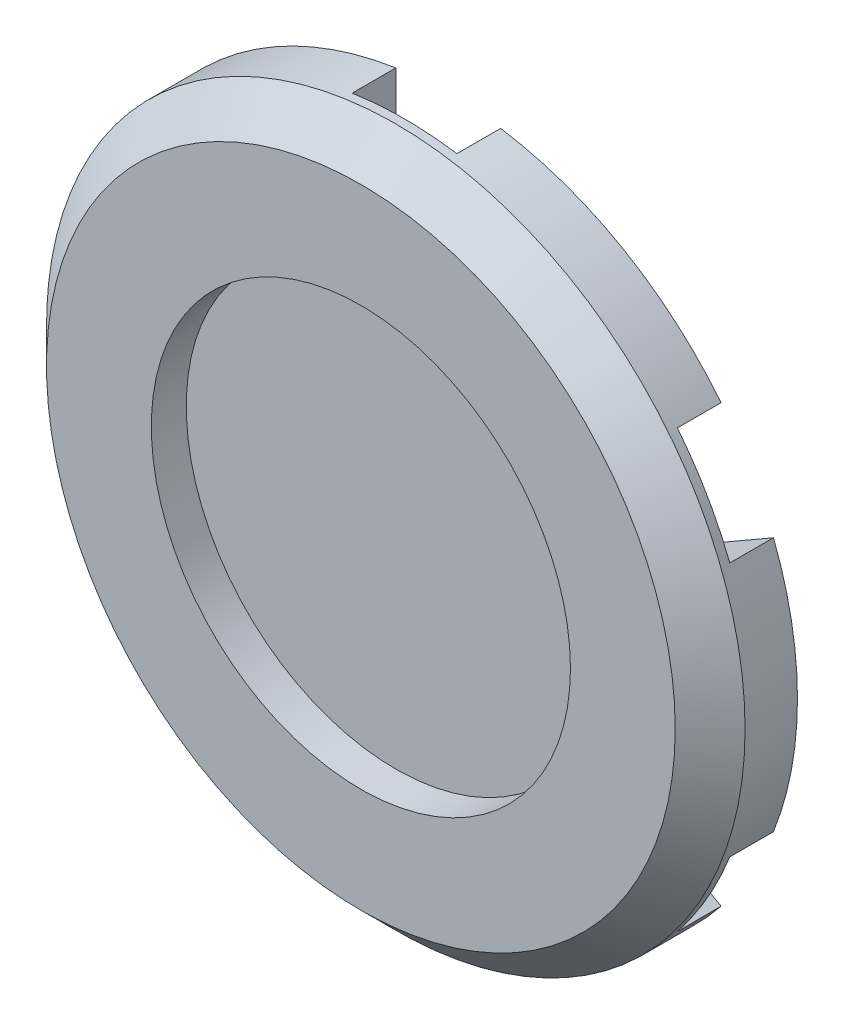
ISO-10303-21;
HEADER;
FILE_DESCRIPTION(('STEP AP214'),'2;1');
FILE_NAME('part.step','',(''),(''),'','','');
FILE_SCHEMA(('AUTOMOTIVE_DESIGN { 1 0 10303 214 1 1 1 1 }'));
ENDSEC;
DATA;
#1=APPLICATION_CONTEXT('core data for automotive mechanical design processes');
#2=APPLICATION_PROTOCOL_DEFINITION('international standard','automotive_design',2000,#1);
#3=PRODUCT_CONTEXT('',#1,'mechanical');
#4=PRODUCT('Part','Part','',(#3));
#5=PRODUCT_RELATED_PRODUCT_CATEGORY('part','',(#4));
#6=PRODUCT_DEFINITION_FORMATION('','',#4);
#7=PRODUCT_DEFINITION_CONTEXT('part definition',#1,'design');
#8=PRODUCT_DEFINITION('design','',#6,#7);
#9=PRODUCT_DEFINITION_SHAPE('','',#8);
#10=(LENGTH_UNIT() NAMED_UNIT(*) SI_UNIT(.MILLI.,.METRE.));
#11=(NAMED_UNIT(*) PLANE_ANGLE_UNIT() SI_UNIT($,.RADIAN.));
#12=(NAMED_UNIT(*) SI_UNIT($,.STERADIAN.) SOLID_ANGLE_UNIT());
#13=UNCERTAINTY_MEASURE_WITH_UNIT(LENGTH_MEASURE(1.E-05),#10,'distance_accuracy_value','');
#14=(GEOMETRIC_REPRESENTATION_CONTEXT(3) GLOBAL_UNCERTAINTY_ASSIGNED_CONTEXT((#13)) GLOBAL_UNIT_ASSIGNED_CONTEXT((#10,
#11,#12)) REPRESENTATION_CONTEXT('',''));
#15=CARTESIAN_POINT('',(0.,0.,0.));
#16=DIRECTION('',(0.,0.,1.));
#17=DIRECTION('',(1.,0.,0.));
#18=AXIS2_PLACEMENT_3D('',#15,#16,#17);
#19=CARTESIAN_POINT('',(0.,0.,25.));
#20=DIRECTION('',(0.,0.,-1.));
#21=DIRECTION('',(-1.,0.,0.));
#22=AXIS2_PLACEMENT_3D('',#19,#20,#21);
#23=CYLINDRICAL_SURFACE('',#22,100.);
#24=CARTESIAN_POINT('',(0.,0.,14.9999999999999));
#25=DIRECTION('',(0.,0.,1.));
#26=DIRECTION('',(1.,0.,0.));
#27=AXIS2_PLACEMENT_3D('',#24,#25,#26);
#28=CIRCLE('',#27,100.);
#29=CARTESIAN_POINT('',(100.,0.,14.9999999999999));
#30=VERTEX_POINT('',#29);
#31=EDGE_CURVE('E11',#30,#30,#28,.F.);
#32=ORIENTED_EDGE('',*,*,#31,.T.);
#33=EDGE_LOOP('',(#32));
#34=FACE_BOUND('',#33,.T.);
#35=CARTESIAN_POINT('',(0.,0.,12.5));
#36=DIRECTION('',(0.,0.,-1.));
#37=DIRECTION('',(-0.50000000000001,0.866025403784433,0.));
#38=AXIS2_PLACEMENT_3D('',#35,#36,#37);
#39=CIRCLE('',#38,100.);
#40=CARTESIAN_POINT('',(-78.1227189477178,-62.4246808899805,12.5));
#41=VERTEX_POINT('',#40);
#42=CARTESIAN_POINT('',(-93.1227189477181,-36.4439187764475,12.5));
#43=VERTEX_POINT('',#42);
#44=EDGE_CURVE('E329',#41,#43,#39,.T.);
#45=ORIENTED_EDGE('',*,*,#44,.F.);
#46=DIRECTION('',(0.,0.,-1.));
#47=VECTOR('',#46,1.);
#48=CARTESIAN_POINT('',(-78.1227189477178,-62.4246808899805,12.5));
#49=LINE('',#48,#47);
#50=CARTESIAN_POINT('',(-78.1227189477178,-62.4246808899805,0.));
#51=VERTEX_POINT('',#50);
#52=EDGE_CURVE('E312',#41,#51,#49,.T.);
#53=ORIENTED_EDGE('',*,*,#52,.T.);
#54=CARTESIAN_POINT('',(0.,0.,0.));
#55=DIRECTION('',(0.,0.,1.));
#56=DIRECTION('',(1.,0.,0.));
#57=AXIS2_PLACEMENT_3D('',#54,#55,#56);
#58=CIRCLE('',#57,100.);
#59=CARTESIAN_POINT('',(-15.,-98.868599666426,0.));
#60=VERTEX_POINT('',#59);
#61=EDGE_CURVE('E452',#51,#60,#58,.T.);
#62=ORIENTED_EDGE('',*,*,#61,.T.);
#63=DIRECTION('',(0.,0.,-1.));
#64=VECTOR('',#63,1.);
#65=CARTESIAN_POINT('',(-15.,-98.868599666426,12.5));
#66=LINE('',#65,#64);
#67=CARTESIAN_POINT('',(-15.,-98.868599666426,12.5));
#68=VERTEX_POINT('',#67);
#69=EDGE_CURVE('E424',#68,#60,#66,.T.);
#70=ORIENTED_EDGE('',*,*,#69,.F.);
#71=CARTESIAN_POINT('',(0.,0.,12.5));
#72=DIRECTION('',(0.,0.,-1.));
#73=DIRECTION('',(-1.,0.,0.));
#74=AXIS2_PLACEMENT_3D('',#71,#72,#73);
#75=CIRCLE('',#74,100.);
#76=CARTESIAN_POINT('',(15.,-98.868599666426,12.5));
#77=VERTEX_POINT('',#76);
#78=EDGE_CURVE('E407',#77,#68,#75,.T.);
#79=ORIENTED_EDGE('',*,*,#78,.F.);
#80=DIRECTION('',(0.,0.,-1.));
#81=VECTOR('',#80,1.);
#82=CARTESIAN_POINT('',(15.,-98.868599666426,12.5));
#83=LINE('',#82,#81);
#84=CARTESIAN_POINT('',(15.,-98.868599666426,0.));
#85=VERTEX_POINT('',#84);
#86=EDGE_CURVE('E434',#77,#85,#83,.T.);
#87=ORIENTED_EDGE('',*,*,#86,.T.);
#88=CARTESIAN_POINT('',(78.1227189477187,-62.4246808899794,0.));
#89=VERTEX_POINT('',#88);
#90=EDGE_CURVE('E456',#85,#89,#58,.T.);
#91=ORIENTED_EDGE('',*,*,#90,.T.);
#92=DIRECTION('',(0.,0.,-1.));
#93=VECTOR('',#92,1.);
#94=CARTESIAN_POINT('',(78.1227189477187,-62.4246808899794,12.5));
#95=LINE('',#94,#93);
#96=CARTESIAN_POINT('',(78.1227189477187,-62.4246808899794,12.5));
#97=VERTEX_POINT('',#96);
#98=EDGE_CURVE('E383',#97,#89,#95,.T.);
#99=ORIENTED_EDGE('',*,*,#98,.F.);
#100=CARTESIAN_POINT('',(0.,0.,12.5));
#101=DIRECTION('',(0.,0.,-1.));
#102=DIRECTION('',(-0.499999999999998,-0.86602540378444,0.));
#103=AXIS2_PLACEMENT_3D('',#100,#101,#102);
#104=CIRCLE('',#103,100.);
#105=CARTESIAN_POINT('',(93.1227189477186,-36.4439187764462,12.5));
#106=VERTEX_POINT('',#105);
#107=EDGE_CURVE('E366',#106,#97,#104,.T.);
#108=ORIENTED_EDGE('',*,*,#107,.F.);
#109=DIRECTION('',(0.,0.,-1.));
#110=VECTOR('',#109,1.);
#111=CARTESIAN_POINT('',(93.1227189477186,-36.4439187764462,12.5));
#112=LINE('',#111,#110);
#113=CARTESIAN_POINT('',(93.1227189477186,-36.4439187764462,0.));
#114=VERTEX_POINT('',#113);
#115=EDGE_CURVE('E395',#106,#114,#112,.T.);
#116=ORIENTED_EDGE('',*,*,#115,.T.);
#117=CARTESIAN_POINT('',(93.1227189477184,36.4439187764468,0.));
#118=VERTEX_POINT('',#117);
#119=EDGE_CURVE('E239',#114,#118,#58,.T.);
#120=ORIENTED_EDGE('',*,*,#119,.T.);
#121=DIRECTION('',(0.,0.,-1.));
#122=VECTOR('',#121,1.);
#123=CARTESIAN_POINT('',(93.1227189477184,36.4439187764468,12.5));
#124=LINE('',#123,#122);
#125=CARTESIAN_POINT('',(93.1227189477184,36.4439187764468,12.5));
#126=VERTEX_POINT('',#125);
#127=EDGE_CURVE('E215',#126,#118,#124,.T.);
#128=ORIENTED_EDGE('',*,*,#127,.F.);
#129=CARTESIAN_POINT('',(0.,0.,12.5));
#130=DIRECTION('',(0.,0.,-1.));
#131=DIRECTION('',(0.500000000000004,-0.866025403784436,0.));
#132=AXIS2_PLACEMENT_3D('',#129,#130,#131);
#133=CIRCLE('',#132,100.);
#134=CARTESIAN_POINT('',(78.1227189477183,62.4246808899799,12.5));
#135=VERTEX_POINT('',#134);
#136=EDGE_CURVE('E223',#135,#126,#133,.T.);
#137=ORIENTED_EDGE('',*,*,#136,.F.);
#138=DIRECTION('',(0.,0.,-1.));
#139=VECTOR('',#138,1.);
#140=CARTESIAN_POINT('',(78.1227189477183,62.4246808899799,12.5));
#141=LINE('',#140,#139);
#142=CARTESIAN_POINT('',(78.1227189477183,62.4246808899799,0.));
#143=VERTEX_POINT('',#142);
#144=EDGE_CURVE('E389',#135,#143,#141,.T.);
#145=ORIENTED_EDGE('',*,*,#144,.T.);
#146=CARTESIAN_POINT('',(15.,98.868599666426,0.));
#147=VERTEX_POINT('',#146);
#148=EDGE_CURVE('E764',#143,#147,#58,.T.);
#149=ORIENTED_EDGE('',*,*,#148,.T.);
#150=DIRECTION('',(0.,0.,-1.));
#151=VECTOR('',#150,1.);
#152=CARTESIAN_POINT('',(15.,98.868599666426,12.5));
#153=LINE('',#152,#151);
#154=CARTESIAN_POINT('',(15.,98.868599666426,12.5));
#155=VERTEX_POINT('',#154);
#156=EDGE_CURVE('E266',#155,#147,#153,.T.);
#157=ORIENTED_EDGE('',*,*,#156,.F.);
#158=CARTESIAN_POINT('',(0.,0.,12.5));
#159=DIRECTION('',(0.,0.,-1.));
#160=DIRECTION('',(1.,0.,0.));
#161=AXIS2_PLACEMENT_3D('',#158,#159,#160);
#162=CIRCLE('',#161,100.);
#163=CARTESIAN_POINT('',(-15.,98.868599666426,12.5));
#164=VERTEX_POINT('',#163);
#165=EDGE_CURVE('E249',#164,#155,#162,.T.);
#166=ORIENTED_EDGE('',*,*,#165,.F.);
#167=DIRECTION('',(0.,0.,-1.));
#168=VECTOR('',#167,1.);
#169=CARTESIAN_POINT('',(-15.,98.868599666426,12.5));
#170=LINE('',#169,#168);
#171=CARTESIAN_POINT('',(-15.,98.868599666426,0.));
#172=VERTEX_POINT('',#171);
#173=EDGE_CURVE('E278',#164,#172,#170,.T.);
#174=ORIENTED_EDGE('',*,*,#173,.T.);
#175=CARTESIAN_POINT('',(-78.1227189477191,62.4246808899788,0.));
#176=VERTEX_POINT('',#175);
#177=EDGE_CURVE('E771',#172,#176,#58,.T.);
#178=ORIENTED_EDGE('',*,*,#177,.T.);
#179=DIRECTION('',(0.,0.,-1.));
#180=VECTOR('',#179,1.);
#181=CARTESIAN_POINT('',(-78.1227189477191,62.4246808899788,12.5));
#182=LINE('',#181,#180);
#183=CARTESIAN_POINT('',(-78.1227189477191,62.4246808899788,12.5));
#184=VERTEX_POINT('',#183);
#185=EDGE_CURVE('E71',#184,#176,#182,.T.);
#186=ORIENTED_EDGE('',*,*,#185,.F.);
#187=CARTESIAN_POINT('',(0.,0.,12.5));
#188=DIRECTION('',(0.,0.,-1.));
#189=DIRECTION('',(0.499999999999992,0.866025403784443,0.));
#190=AXIS2_PLACEMENT_3D('',#187,#188,#189);
#191=CIRCLE('',#190,100.);
#192=CARTESIAN_POINT('',(-93.1227189477189,36.4439187764455,12.5));
#193=VERTEX_POINT('',#192);
#194=EDGE_CURVE('E291',#193,#184,#191,.T.);
#195=ORIENTED_EDGE('',*,*,#194,.F.);
#196=DIRECTION('',(0.,0.,-1.));
#197=VECTOR('',#196,1.);
#198=CARTESIAN_POINT('',(-93.1227189477189,36.4439187764455,12.5));
#199=LINE('',#198,#197);
#200=CARTESIAN_POINT('',(-93.1227189477189,36.4439187764455,0.));
#201=VERTEX_POINT('',#200);
#202=EDGE_CURVE('E272',#193,#201,#199,.T.);
#203=ORIENTED_EDGE('',*,*,#202,.T.);
#204=CARTESIAN_POINT('',(-93.1227189477181,-36.4439187764475,0.));
#205=VERTEX_POINT('',#204);
#206=EDGE_CURVE('E775',#201,#205,#58,.T.);
#207=ORIENTED_EDGE('',*,*,#206,.T.);
#208=DIRECTION('',(0.,0.,-1.));
#209=VECTOR('',#208,1.);
#210=CARTESIAN_POINT('',(-93.1227189477181,-36.4439187764475,12.5));
#211=LINE('',#210,#209);
#212=EDGE_CURVE('E63',#43,#205,#211,.T.);
#213=ORIENTED_EDGE('',*,*,#212,.F.);
#214=EDGE_LOOP('',(#45,#53,#62,#70,#79,#87,#91,#99,#108,#116,#120,#128,#137,#145,#149,#157,#166,
#174,#178,#186,#195,#203,#207,#213));
#215=FACE_BOUND('',#214,.T.);
#216=ADVANCED_FACE('F46',(#34,#215),#23,.T.);
#217=CARTESIAN_POINT('',(0.,0.,25.));
#218=DIRECTION('',(0.,0.,1.));
#219=DIRECTION('',(1.,0.,0.));
#220=AXIS2_PLACEMENT_3D('',#217,#218,#219);
#221=PLANE('',#220);
#222=CARTESIAN_POINT('',(0.,0.,25.));
#223=DIRECTION('',(0.,0.,1.));
#224=DIRECTION('',(1.,0.,0.));
#225=AXIS2_PLACEMENT_3D('',#222,#223,#224);
#226=CIRCLE('',#225,89.9999999999999);
#227=CARTESIAN_POINT('',(89.9999999999999,0.,25.));
#228=VERTEX_POINT('',#227);
#229=EDGE_CURVE('E56',#228,#228,#226,.T.);
#230=ORIENTED_EDGE('',*,*,#229,.T.);
#231=EDGE_LOOP('',(#230));
#232=FACE_BOUND('',#231,.T.);
#233=CARTESIAN_POINT('',(0.,0.,25.));
#234=DIRECTION('',(0.,0.,1.));
#235=DIRECTION('',(1.,0.,0.));
#236=AXIS2_PLACEMENT_3D('',#233,#234,#235);
#237=CIRCLE('',#236,60.);
#238=CARTESIAN_POINT('',(60.,0.,25.));
#239=VERTEX_POINT('',#238);
#240=EDGE_CURVE('E438',#239,#239,#237,.T.);
#241=ORIENTED_EDGE('',*,*,#240,.F.);
#242=EDGE_LOOP('',(#241));
#243=FACE_BOUND('',#242,.T.);
#244=ADVANCED_FACE('F463',(#232,#243),#221,.T.);
#245=CARTESIAN_POINT('',(0.,0.,0.));
#246=DIRECTION('',(0.,0.,1.));
#247=DIRECTION('',(1.,0.,0.));
#248=AXIS2_PLACEMENT_3D('',#245,#246,#247);
#249=PLANE('',#248);
#250=ORIENTED_EDGE('',*,*,#61,.F.);
#251=DIRECTION('',(-0.866025403784433,-0.50000000000001,0.));
#252=VECTOR('',#251,1.);
#253=CARTESIAN_POINT('',(-78.1227189477178,-62.4246808899805,0.));
#254=LINE('',#253,#252);
#255=CARTESIAN_POINT('',(-52.1419568341848,-47.4246808899802,0.));
#256=VERTEX_POINT('',#255);
#257=EDGE_CURVE('E334',#256,#51,#254,.T.);
#258=ORIENTED_EDGE('',*,*,#257,.F.);
#259=DIRECTION('',(0.50000000000001,-0.866025403784433,0.));
#260=VECTOR('',#259,1.);
#261=CARTESIAN_POINT('',(-67.1419568341851,-21.4439187764472,0.));
#262=LINE('',#261,#260);
#263=CARTESIAN_POINT('',(-67.1419568341851,-21.4439187764472,0.));
#264=VERTEX_POINT('',#263);
#265=EDGE_CURVE('E349',#264,#256,#262,.T.);
#266=ORIENTED_EDGE('',*,*,#265,.F.);
#267=DIRECTION('',(0.866025403784433,0.50000000000001,0.));
#268=VECTOR('',#267,1.);
#269=CARTESIAN_POINT('',(-93.1227189477181,-36.4439187764475,0.));
#270=LINE('',#269,#268);
#271=EDGE_CURVE('E346',#205,#264,#270,.T.);
#272=ORIENTED_EDGE('',*,*,#271,.F.);
#273=ORIENTED_EDGE('',*,*,#206,.F.);
#274=DIRECTION('',(-0.866025403784443,0.499999999999992,0.));
#275=VECTOR('',#274,1.);
#276=CARTESIAN_POINT('',(-93.1227189477189,36.4439187764455,0.));
#277=LINE('',#276,#275);
#278=CARTESIAN_POINT('',(-67.1419568341856,21.4439187764458,0.));
#279=VERTEX_POINT('',#278);
#280=EDGE_CURVE('E296',#279,#201,#277,.T.);
#281=ORIENTED_EDGE('',*,*,#280,.F.);
#282=DIRECTION('',(-0.499999999999992,-0.866025403784443,0.));
#283=VECTOR('',#282,1.);
#284=CARTESIAN_POINT('',(-52.1419568341858,47.4246808899791,0.));
#285=LINE('',#284,#283);
#286=CARTESIAN_POINT('',(-52.1419568341858,47.4246808899791,0.));
#287=VERTEX_POINT('',#286);
#288=EDGE_CURVE('E311',#287,#279,#285,.T.);
#289=ORIENTED_EDGE('',*,*,#288,.F.);
#290=DIRECTION('',(0.866025403784443,-0.499999999999992,0.));
#291=VECTOR('',#290,1.);
#292=CARTESIAN_POINT('',(-78.1227189477191,62.4246808899788,0.));
#293=LINE('',#292,#291);
#294=EDGE_CURVE('E308',#176,#287,#293,.T.);
#295=ORIENTED_EDGE('',*,*,#294,.F.);
#296=ORIENTED_EDGE('',*,*,#177,.F.);
#297=DIRECTION('',(0.,1.,0.));
#298=VECTOR('',#297,1.);
#299=CARTESIAN_POINT('',(-15.,98.868599666426,0.));
#300=LINE('',#299,#298);
#301=CARTESIAN_POINT('',(-15.,68.868599666426,0.));
#302=VERTEX_POINT('',#301);
#303=EDGE_CURVE('E254',#302,#172,#300,.T.);
#304=ORIENTED_EDGE('',*,*,#303,.F.);
#305=DIRECTION('',(-1.,0.,0.));
#306=VECTOR('',#305,1.);
#307=CARTESIAN_POINT('',(15.,68.868599666426,0.));
#308=LINE('',#307,#306);
#309=CARTESIAN_POINT('',(15.,68.868599666426,0.));
#310=VERTEX_POINT('',#309);
#311=EDGE_CURVE('E271',#310,#302,#308,.T.);
#312=ORIENTED_EDGE('',*,*,#311,.F.);
#313=DIRECTION('',(0.,-1.,0.));
#314=VECTOR('',#313,1.);
#315=CARTESIAN_POINT('',(15.,98.868599666426,0.));
#316=LINE('',#315,#314);
#317=EDGE_CURVE('E267',#147,#310,#316,.T.);
#318=ORIENTED_EDGE('',*,*,#317,.F.);
#319=ORIENTED_EDGE('',*,*,#148,.F.);
#320=DIRECTION('',(0.866025403784436,0.500000000000004,0.));
#321=VECTOR('',#320,1.);
#322=CARTESIAN_POINT('',(78.1227189477183,62.4246808899799,0.));
#323=LINE('',#322,#321);
#324=CARTESIAN_POINT('',(52.1419568341852,47.4246808899798,0.));
#325=VERTEX_POINT('',#324);
#326=EDGE_CURVE('E233',#325,#143,#323,.T.);
#327=ORIENTED_EDGE('',*,*,#326,.F.);
#328=DIRECTION('',(-0.500000000000004,0.866025403784436,0.));
#329=VECTOR('',#328,1.);
#330=CARTESIAN_POINT('',(67.1419568341853,21.4439187764467,0.));
#331=LINE('',#330,#329);
#332=CARTESIAN_POINT('',(67.1419568341853,21.4439187764467,0.));
#333=VERTEX_POINT('',#332);
#334=EDGE_CURVE('E760',#333,#325,#331,.T.);
#335=ORIENTED_EDGE('',*,*,#334,.F.);
#336=DIRECTION('',(-0.866025403784437,-0.500000000000004,0.));
#337=VECTOR('',#336,1.);
#338=CARTESIAN_POINT('',(93.1227189477184,36.4439187764468,0.));
#339=LINE('',#338,#337);
#340=EDGE_CURVE('E282',#118,#333,#339,.T.);
#341=ORIENTED_EDGE('',*,*,#340,.F.);
#342=ORIENTED_EDGE('',*,*,#119,.F.);
#343=DIRECTION('',(0.86602540378444,-0.499999999999998,0.));
#344=VECTOR('',#343,1.);
#345=CARTESIAN_POINT('',(93.1227189477186,-36.4439187764462,0.));
#346=LINE('',#345,#344);
#347=CARTESIAN_POINT('',(67.1419568341854,-21.4439187764462,0.));
#348=VERTEX_POINT('',#347);
#349=EDGE_CURVE('E371',#348,#114,#346,.T.);
#350=ORIENTED_EDGE('',*,*,#349,.F.);
#351=DIRECTION('',(0.499999999999998,0.86602540378444,0.));
#352=VECTOR('',#351,1.);
#353=CARTESIAN_POINT('',(52.1419568341855,-47.4246808899794,0.));
#354=LINE('',#353,#352);
#355=CARTESIAN_POINT('',(52.1419568341855,-47.4246808899794,0.));
#356=VERTEX_POINT('',#355);
#357=EDGE_CURVE('E388',#356,#348,#354,.T.);
#358=ORIENTED_EDGE('',*,*,#357,.F.);
#359=DIRECTION('',(-0.86602540378444,0.499999999999998,0.));
#360=VECTOR('',#359,1.);
#361=CARTESIAN_POINT('',(78.1227189477187,-62.4246808899794,0.));
#362=LINE('',#361,#360);
#363=EDGE_CURVE('E384',#89,#356,#362,.T.);
#364=ORIENTED_EDGE('',*,*,#363,.F.);
#365=ORIENTED_EDGE('',*,*,#90,.F.);
#366=DIRECTION('',(0.,-1.,0.));
#367=VECTOR('',#366,1.);
#368=CARTESIAN_POINT('',(15.,-98.868599666426,0.));
#369=LINE('',#368,#367);
#370=CARTESIAN_POINT('',(15.,-68.868599666426,0.));
#371=VERTEX_POINT('',#370);
#372=EDGE_CURVE('E412',#371,#85,#369,.T.);
#373=ORIENTED_EDGE('',*,*,#372,.F.);
#374=DIRECTION('',(1.,0.,0.));
#375=VECTOR('',#374,1.);
#376=CARTESIAN_POINT('',(-15.,-68.868599666426,0.));
#377=LINE('',#376,#375);
#378=CARTESIAN_POINT('',(-15.,-68.868599666426,0.));
#379=VERTEX_POINT('',#378);
#380=EDGE_CURVE('E428',#379,#371,#377,.T.);
#381=ORIENTED_EDGE('',*,*,#380,.F.);
#382=DIRECTION('',(0.,1.,0.));
#383=VECTOR('',#382,1.);
#384=CARTESIAN_POINT('',(-15.,-98.868599666426,0.));
#385=LINE('',#384,#383);
#386=EDGE_CURVE('E398',#60,#379,#385,.T.);
#387=ORIENTED_EDGE('',*,*,#386,.F.);
#388=EDGE_LOOP('',(#250,#258,#266,#272,#273,#281,#289,#295,#296,#304,#312,#318,#319,#327,#335,
#341,#342,#350,#358,#364,#365,#373,#381,#387));
#389=FACE_BOUND('',#388,.T.);
#390=ADVANCED_FACE('F488',(#389),#249,.F.);
#391=CARTESIAN_POINT('',(0.,0.,15.));
#392=DIRECTION('',(0.,0.,1.));
#393=DIRECTION('',(1.,0.,0.));
#394=AXIS2_PLACEMENT_3D('',#391,#392,#393);
#395=CYLINDRICAL_SURFACE('',#394,60.);
#396=CARTESIAN_POINT('',(0.,0.,15.));
#397=DIRECTION('',(0.,0.,1.));
#398=DIRECTION('',(1.,0.,0.));
#399=AXIS2_PLACEMENT_3D('',#396,#397,#398);
#400=CIRCLE('',#399,60.);
#401=CARTESIAN_POINT('',(60.,0.,15.));
#402=VERTEX_POINT('',#401);
#403=EDGE_CURVE('E448',#402,#402,#400,.T.);
#404=ORIENTED_EDGE('',*,*,#403,.F.);
#405=EDGE_LOOP('',(#404));
#406=FACE_BOUND('',#405,.T.);
#407=ORIENTED_EDGE('',*,*,#240,.T.);
#408=EDGE_LOOP('',(#407));
#409=FACE_BOUND('',#408,.T.);
#410=ADVANCED_FACE('F478',(#406,#409),#395,.F.);
#411=CARTESIAN_POINT('',(0.,0.,15.));
#412=DIRECTION('',(0.,0.,1.));
#413=DIRECTION('',(1.,0.,0.));
#414=AXIS2_PLACEMENT_3D('',#411,#412,#413);
#415=PLANE('',#414);
#416=ORIENTED_EDGE('',*,*,#403,.T.);
#417=EDGE_LOOP('',(#416));
#418=FACE_BOUND('',#417,.T.);
#419=ADVANCED_FACE('F468',(#418),#415,.T.);
#420=CARTESIAN_POINT('',(0.,0.,25.));
#421=DIRECTION('',(0.,0.,-1.));
#422=DIRECTION('',(-1.,0.,0.));
#423=AXIS2_PLACEMENT_3D('',#420,#421,#422);
#424=CONICAL_SURFACE('',#423,89.9999999999999,0.785398163397448);
#425=ORIENTED_EDGE('',*,*,#31,.F.);
#426=EDGE_LOOP('',(#425));
#427=FACE_BOUND('',#426,.T.);
#428=ORIENTED_EDGE('',*,*,#229,.F.);
#429=EDGE_LOOP('',(#428));
#430=FACE_BOUND('',#429,.T.);
#431=ADVANCED_FACE('F49',(#427,#430),#424,.T.);
#432=CARTESIAN_POINT('',(15.,-98.868599666426,12.5));
#433=DIRECTION('',(1.,0.,0.));
#434=DIRECTION('',(0.,1.,0.));
#435=AXIS2_PLACEMENT_3D('',#432,#433,#434);
#436=PLANE('',#435);
#437=ORIENTED_EDGE('',*,*,#372,.T.);
#438=ORIENTED_EDGE('',*,*,#86,.F.);
#439=DIRECTION('',(0.,-1.,0.));
#440=VECTOR('',#439,1.);
#441=CARTESIAN_POINT('',(15.,-98.868599666426,12.5));
#442=LINE('',#441,#440);
#443=CARTESIAN_POINT('',(15.,-68.868599666426,12.5));
#444=VERTEX_POINT('',#443);
#445=EDGE_CURVE('E420',#444,#77,#442,.T.);
#446=ORIENTED_EDGE('',*,*,#445,.F.);
#447=DIRECTION('',(0.,0.,-1.));
#448=VECTOR('',#447,1.);
#449=CARTESIAN_POINT('',(15.,-68.868599666426,12.5));
#450=LINE('',#449,#448);
#451=EDGE_CURVE('E439',#444,#371,#450,.T.);
#452=ORIENTED_EDGE('',*,*,#451,.T.);
#453=EDGE_LOOP('',(#437,#438,#446,#452));
#454=FACE_BOUND('',#453,.T.);
#455=ADVANCED_FACE('F467',(#454),#436,.F.);
#456=CARTESIAN_POINT('',(-15.,-68.868599666426,12.5));
#457=DIRECTION('',(0.,1.,0.));
#458=DIRECTION('',(0.,0.,1.));
#459=AXIS2_PLACEMENT_3D('',#456,#457,#458);
#460=PLANE('',#459);
#461=ORIENTED_EDGE('',*,*,#380,.T.);
#462=ORIENTED_EDGE('',*,*,#451,.F.);
#463=DIRECTION('',(1.,0.,0.));
#464=VECTOR('',#463,1.);
#465=CARTESIAN_POINT('',(-15.,-68.868599666426,12.5));
#466=LINE('',#465,#464);
#467=CARTESIAN_POINT('',(-15.,-68.868599666426,12.5));
#468=VERTEX_POINT('',#467);
#469=EDGE_CURVE('E416',#468,#444,#466,.T.);
#470=ORIENTED_EDGE('',*,*,#469,.F.);
#471=DIRECTION('',(0.,0.,-1.));
#472=VECTOR('',#471,1.);
#473=CARTESIAN_POINT('',(-15.,-68.868599666426,12.5));
#474=LINE('',#473,#472);
#475=EDGE_CURVE('E442',#468,#379,#474,.T.);
#476=ORIENTED_EDGE('',*,*,#475,.T.);
#477=EDGE_LOOP('',(#461,#462,#470,#476));
#478=FACE_BOUND('',#477,.T.);
#479=ADVANCED_FACE('F474',(#478),#460,.F.);
#480=CARTESIAN_POINT('',(-15.,-98.868599666426,12.5));
#481=DIRECTION('',(-1.,0.,0.));
#482=DIRECTION('',(0.,-1.,0.));
#483=AXIS2_PLACEMENT_3D('',#480,#481,#482);
#484=PLANE('',#483);
#485=ORIENTED_EDGE('',*,*,#386,.T.);
#486=ORIENTED_EDGE('',*,*,#475,.F.);
#487=DIRECTION('',(0.,1.,0.));
#488=VECTOR('',#487,1.);
#489=CARTESIAN_POINT('',(-15.,-98.868599666426,12.5));
#490=LINE('',#489,#488);
#491=EDGE_CURVE('E411',#68,#468,#490,.T.);
#492=ORIENTED_EDGE('',*,*,#491,.F.);
#493=ORIENTED_EDGE('',*,*,#69,.T.);
#494=EDGE_LOOP('',(#485,#486,#492,#493));
#495=FACE_BOUND('',#494,.T.);
#496=ADVANCED_FACE('F496',(#495),#484,.F.);
#497=CARTESIAN_POINT('',(0.,0.,12.5));
#498=DIRECTION('',(0.,0.,-1.));
#499=DIRECTION('',(-1.,0.,0.));
#500=AXIS2_PLACEMENT_3D('',#497,#498,#499);
#501=PLANE('',#500);
#502=ORIENTED_EDGE('',*,*,#78,.T.);
#503=ORIENTED_EDGE('',*,*,#491,.T.);
#504=ORIENTED_EDGE('',*,*,#469,.T.);
#505=ORIENTED_EDGE('',*,*,#445,.T.);
#506=EDGE_LOOP('',(#502,#503,#504,#505));
#507=FACE_BOUND('',#506,.T.);
#508=ADVANCED_FACE('F499',(#507),#501,.T.);
#509=CARTESIAN_POINT('',(93.1227189477186,-36.4439187764462,12.5));
#510=DIRECTION('',(0.499999999999998,0.86602540378444,0.));
#511=DIRECTION('',(-0.86602540378444,0.499999999999998,0.));
#512=AXIS2_PLACEMENT_3D('',#509,#510,#511);
#513=PLANE('',#512);
#514=ORIENTED_EDGE('',*,*,#349,.T.);
#515=ORIENTED_EDGE('',*,*,#115,.F.);
#516=DIRECTION('',(0.86602540378444,-0.499999999999998,0.));
#517=VECTOR('',#516,1.);
#518=CARTESIAN_POINT('',(93.1227189477186,-36.4439187764462,12.5));
#519=LINE('',#518,#517);
#520=CARTESIAN_POINT('',(67.1419568341854,-21.4439187764462,12.5));
#521=VERTEX_POINT('',#520);
#522=EDGE_CURVE('E379',#521,#106,#519,.T.);
#523=ORIENTED_EDGE('',*,*,#522,.F.);
#524=DIRECTION('',(0.,0.,-1.));
#525=VECTOR('',#524,1.);
#526=CARTESIAN_POINT('',(67.1419568341854,-21.4439187764462,12.5));
#527=LINE('',#526,#525);
#528=EDGE_CURVE('E399',#521,#348,#527,.T.);
#529=ORIENTED_EDGE('',*,*,#528,.T.);
#530=EDGE_LOOP('',(#514,#515,#523,#529));
#531=FACE_BOUND('',#530,.T.);
#532=ADVANCED_FACE('F505',(#531),#513,.F.);
#533=CARTESIAN_POINT('',(52.1419568341855,-47.4246808899794,12.5));
#534=DIRECTION('',(-0.86602540378444,0.499999999999998,0.));
#535=DIRECTION('',(-0.499999999999998,-0.86602540378444,0.));
#536=AXIS2_PLACEMENT_3D('',#533,#534,#535);
#537=PLANE('',#536);
#538=ORIENTED_EDGE('',*,*,#357,.T.);
#539=ORIENTED_EDGE('',*,*,#528,.F.);
#540=DIRECTION('',(0.499999999999998,0.86602540378444,0.));
#541=VECTOR('',#540,1.);
#542=CARTESIAN_POINT('',(52.1419568341855,-47.4246808899794,12.5));
#543=LINE('',#542,#541);
#544=CARTESIAN_POINT('',(52.1419568341855,-47.4246808899794,12.5));
#545=VERTEX_POINT('',#544);
#546=EDGE_CURVE('E375',#545,#521,#543,.T.);
#547=ORIENTED_EDGE('',*,*,#546,.F.);
#548=DIRECTION('',(0.,0.,-1.));
#549=VECTOR('',#548,1.);
#550=CARTESIAN_POINT('',(52.1419568341855,-47.4246808899794,12.5));
#551=LINE('',#550,#549);
#552=EDGE_CURVE('E402',#545,#356,#551,.T.);
#553=ORIENTED_EDGE('',*,*,#552,.T.);
#554=EDGE_LOOP('',(#538,#539,#547,#553));
#555=FACE_BOUND('',#554,.T.);
#556=ADVANCED_FACE('F511',(#555),#537,.F.);
#557=CARTESIAN_POINT('',(78.1227189477187,-62.4246808899794,12.5));
#558=DIRECTION('',(-0.499999999999998,-0.86602540378444,0.));
#559=DIRECTION('',(0.86602540378444,-0.499999999999998,0.));
#560=AXIS2_PLACEMENT_3D('',#557,#558,#559);
#561=PLANE('',#560);
#562=ORIENTED_EDGE('',*,*,#363,.T.);
#563=ORIENTED_EDGE('',*,*,#552,.F.);
#564=DIRECTION('',(-0.86602540378444,0.499999999999998,0.));
#565=VECTOR('',#564,1.);
#566=CARTESIAN_POINT('',(78.1227189477187,-62.4246808899794,12.5));
#567=LINE('',#566,#565);
#568=EDGE_CURVE('E370',#97,#545,#567,.T.);
#569=ORIENTED_EDGE('',*,*,#568,.F.);
#570=ORIENTED_EDGE('',*,*,#98,.T.);
#571=EDGE_LOOP('',(#562,#563,#569,#570));
#572=FACE_BOUND('',#571,.T.);
#573=ADVANCED_FACE('F507',(#572),#561,.F.);
#574=CARTESIAN_POINT('',(0.,0.,12.5));
#575=DIRECTION('',(0.,0.,-1.));
#576=DIRECTION('',(-0.499999999999998,-0.86602540378444,0.));
#577=AXIS2_PLACEMENT_3D('',#574,#575,#576);
#578=PLANE('',#577);
#579=ORIENTED_EDGE('',*,*,#107,.T.);
#580=ORIENTED_EDGE('',*,*,#568,.T.);
#581=ORIENTED_EDGE('',*,*,#546,.T.);
#582=ORIENTED_EDGE('',*,*,#522,.T.);
#583=EDGE_LOOP('',(#579,#580,#581,#582));
#584=FACE_BOUND('',#583,.T.);
#585=ADVANCED_FACE('F510',(#584),#578,.T.);
#586=CARTESIAN_POINT('',(78.1227189477183,62.4246808899799,12.5));
#587=DIRECTION('',(-0.500000000000004,0.866025403784436,0.));
#588=DIRECTION('',(-0.866025403784436,-0.500000000000004,0.));
#589=AXIS2_PLACEMENT_3D('',#586,#587,#588);
#590=PLANE('',#589);
#591=ORIENTED_EDGE('',*,*,#326,.T.);
#592=ORIENTED_EDGE('',*,*,#144,.F.);
#593=DIRECTION('',(0.866025403784436,0.500000000000004,0.));
#594=VECTOR('',#593,1.);
#595=CARTESIAN_POINT('',(78.1227189477183,62.4246808899799,12.5));
#596=LINE('',#595,#594);
#597=CARTESIAN_POINT('',(52.1419568341852,47.4246808899798,12.5));
#598=VERTEX_POINT('',#597);
#599=EDGE_CURVE('E229',#598,#135,#596,.T.);
#600=ORIENTED_EDGE('',*,*,#599,.F.);
#601=DIRECTION('',(0.,0.,-1.));
#602=VECTOR('',#601,1.);
#603=CARTESIAN_POINT('',(52.1419568341852,47.4246808899798,12.5));
#604=LINE('',#603,#602);
#605=EDGE_CURVE('E244',#598,#325,#604,.T.);
#606=ORIENTED_EDGE('',*,*,#605,.T.);
#607=EDGE_LOOP('',(#591,#592,#600,#606));
#608=FACE_BOUND('',#607,.T.);
#609=ADVANCED_FACE('F521',(#608),#590,.F.);
#610=CARTESIAN_POINT('',(67.1419568341853,21.4439187764467,12.5));
#611=DIRECTION('',(-0.866025403784436,-0.500000000000004,0.));
#612=DIRECTION('',(0.500000000000004,-0.866025403784436,0.));
#613=AXIS2_PLACEMENT_3D('',#610,#611,#612);
#614=PLANE('',#613);
#615=ORIENTED_EDGE('',*,*,#334,.T.);
#616=ORIENTED_EDGE('',*,*,#605,.F.);
#617=DIRECTION('',(-0.500000000000004,0.866025403784436,0.));
#618=VECTOR('',#617,1.);
#619=CARTESIAN_POINT('',(67.1419568341853,21.4439187764467,12.5));
#620=LINE('',#619,#618);
#621=CARTESIAN_POINT('',(67.1419568341853,21.4439187764467,12.5));
#622=VERTEX_POINT('',#621);
#623=EDGE_CURVE('E222',#622,#598,#620,.T.);
#624=ORIENTED_EDGE('',*,*,#623,.F.);
#625=DIRECTION('',(0.,0.,-1.));
#626=VECTOR('',#625,1.);
#627=CARTESIAN_POINT('',(67.1419568341853,21.4439187764467,12.5));
#628=LINE('',#627,#626);
#629=EDGE_CURVE('E217',#622,#333,#628,.T.);
#630=ORIENTED_EDGE('',*,*,#629,.T.);
#631=EDGE_LOOP('',(#615,#616,#624,#630));
#632=FACE_BOUND('',#631,.T.);
#633=ADVANCED_FACE('F571',(#632),#614,.F.);
#634=CARTESIAN_POINT('',(93.1227189477184,36.4439187764468,12.5));
#635=DIRECTION('',(0.500000000000004,-0.866025403784436,0.));
#636=DIRECTION('',(0.866025403784436,0.500000000000004,0.));
#637=AXIS2_PLACEMENT_3D('',#634,#635,#636);
#638=PLANE('',#637);
#639=ORIENTED_EDGE('',*,*,#340,.T.);
#640=ORIENTED_EDGE('',*,*,#629,.F.);
#641=DIRECTION('',(-0.866025403784437,-0.500000000000004,0.));
#642=VECTOR('',#641,1.);
#643=CARTESIAN_POINT('',(93.1227189477184,36.4439187764468,12.5));
#644=LINE('',#643,#642);
#645=EDGE_CURVE('E210',#126,#622,#644,.T.);
#646=ORIENTED_EDGE('',*,*,#645,.F.);
#647=ORIENTED_EDGE('',*,*,#127,.T.);
#648=EDGE_LOOP('',(#639,#640,#646,#647));
#649=FACE_BOUND('',#648,.T.);
#650=ADVANCED_FACE('F213',(#649),#638,.F.);
#651=CARTESIAN_POINT('',(0.,0.,12.5));
#652=DIRECTION('',(0.,0.,-1.));
#653=DIRECTION('',(0.500000000000004,-0.866025403784436,0.));
#654=AXIS2_PLACEMENT_3D('',#651,#652,#653);
#655=PLANE('',#654);
#656=ORIENTED_EDGE('',*,*,#136,.T.);
#657=ORIENTED_EDGE('',*,*,#645,.T.);
#658=ORIENTED_EDGE('',*,*,#623,.T.);
#659=ORIENTED_EDGE('',*,*,#599,.T.);
#660=EDGE_LOOP('',(#656,#657,#658,#659));
#661=FACE_BOUND('',#660,.T.);
#662=ADVANCED_FACE('F227',(#661),#655,.T.);
#663=CARTESIAN_POINT('',(-15.,98.868599666426,12.5));
#664=DIRECTION('',(-1.,0.,0.));
#665=DIRECTION('',(0.,-1.,0.));
#666=AXIS2_PLACEMENT_3D('',#663,#664,#665);
#667=PLANE('',#666);
#668=ORIENTED_EDGE('',*,*,#303,.T.);
#669=ORIENTED_EDGE('',*,*,#173,.F.);
#670=DIRECTION('',(0.,1.,0.));
#671=VECTOR('',#670,1.);
#672=CARTESIAN_POINT('',(-15.,98.868599666426,12.5));
#673=LINE('',#672,#671);
#674=CARTESIAN_POINT('',(-15.,68.868599666426,12.5));
#675=VERTEX_POINT('',#674);
#676=EDGE_CURVE('E262',#675,#164,#673,.T.);
#677=ORIENTED_EDGE('',*,*,#676,.F.);
#678=DIRECTION('',(0.,0.,-1.));
#679=VECTOR('',#678,1.);
#680=CARTESIAN_POINT('',(-15.,68.868599666426,12.5));
#681=LINE('',#680,#679);
#682=EDGE_CURVE('E283',#675,#302,#681,.T.);
#683=ORIENTED_EDGE('',*,*,#682,.T.);
#684=EDGE_LOOP('',(#668,#669,#677,#683));
#685=FACE_BOUND('',#684,.T.);
#686=ADVANCED_FACE('F561',(#685),#667,.F.);
#687=CARTESIAN_POINT('',(15.,68.868599666426,12.5));
#688=DIRECTION('',(0.,-1.,0.));
#689=DIRECTION('',(0.,0.,-1.));
#690=AXIS2_PLACEMENT_3D('',#687,#688,#689);
#691=PLANE('',#690);
#692=ORIENTED_EDGE('',*,*,#311,.T.);
#693=ORIENTED_EDGE('',*,*,#682,.F.);
#694=DIRECTION('',(-1.,0.,0.));
#695=VECTOR('',#694,1.);
#696=CARTESIAN_POINT('',(15.,68.868599666426,12.5));
#697=LINE('',#696,#695);
#698=CARTESIAN_POINT('',(15.,68.868599666426,12.5));
#699=VERTEX_POINT('',#698);
#700=EDGE_CURVE('E258',#699,#675,#697,.T.);
#701=ORIENTED_EDGE('',*,*,#700,.F.);
#702=DIRECTION('',(0.,0.,-1.));
#703=VECTOR('',#702,1.);
#704=CARTESIAN_POINT('',(15.,68.868599666426,12.5));
#705=LINE('',#704,#703);
#706=EDGE_CURVE('E286',#699,#310,#705,.T.);
#707=ORIENTED_EDGE('',*,*,#706,.T.);
#708=EDGE_LOOP('',(#692,#693,#701,#707));
#709=FACE_BOUND('',#708,.T.);
#710=ADVANCED_FACE('F557',(#709),#691,.F.);
#711=CARTESIAN_POINT('',(15.,98.868599666426,12.5));
#712=DIRECTION('',(1.,0.,0.));
#713=DIRECTION('',(0.,1.,0.));
#714=AXIS2_PLACEMENT_3D('',#711,#712,#713);
#715=PLANE('',#714);
#716=ORIENTED_EDGE('',*,*,#317,.T.);
#717=ORIENTED_EDGE('',*,*,#706,.F.);
#718=DIRECTION('',(0.,-1.,0.));
#719=VECTOR('',#718,1.);
#720=CARTESIAN_POINT('',(15.,98.868599666426,12.5));
#721=LINE('',#720,#719);
#722=EDGE_CURVE('E253',#155,#699,#721,.T.);
#723=ORIENTED_EDGE('',*,*,#722,.F.);
#724=ORIENTED_EDGE('',*,*,#156,.T.);
#725=EDGE_LOOP('',(#716,#717,#723,#724));
#726=FACE_BOUND('',#725,.T.);
#727=ADVANCED_FACE('F554',(#726),#715,.F.);
#728=CARTESIAN_POINT('',(0.,0.,12.5));
#729=DIRECTION('',(0.,0.,-1.));
#730=DIRECTION('',(1.,0.,0.));
#731=AXIS2_PLACEMENT_3D('',#728,#729,#730);
#732=PLANE('',#731);
#733=ORIENTED_EDGE('',*,*,#165,.T.);
#734=ORIENTED_EDGE('',*,*,#722,.T.);
#735=ORIENTED_EDGE('',*,*,#700,.T.);
#736=ORIENTED_EDGE('',*,*,#676,.T.);
#737=EDGE_LOOP('',(#733,#734,#735,#736));
#738=FACE_BOUND('',#737,.T.);
#739=ADVANCED_FACE('F549',(#738),#732,.T.);
#740=CARTESIAN_POINT('',(-93.1227189477189,36.4439187764455,12.5));
#741=DIRECTION('',(-0.499999999999992,-0.866025403784443,0.));
#742=DIRECTION('',(0.866025403784443,-0.499999999999992,0.));
#743=AXIS2_PLACEMENT_3D('',#740,#741,#742);
#744=PLANE('',#743);
#745=ORIENTED_EDGE('',*,*,#280,.T.);
#746=ORIENTED_EDGE('',*,*,#202,.F.);
#747=DIRECTION('',(-0.866025403784443,0.499999999999992,0.));
#748=VECTOR('',#747,1.);
#749=CARTESIAN_POINT('',(-93.1227189477189,36.4439187764455,12.5));
#750=LINE('',#749,#748);
#751=CARTESIAN_POINT('',(-67.1419568341856,21.4439187764458,12.5));
#752=VERTEX_POINT('',#751);
#753=EDGE_CURVE('E304',#752,#193,#750,.T.);
#754=ORIENTED_EDGE('',*,*,#753,.F.);
#755=DIRECTION('',(0.,0.,-1.));
#756=VECTOR('',#755,1.);
#757=CARTESIAN_POINT('',(-67.1419568341856,21.4439187764458,12.5));
#758=LINE('',#757,#756);
#759=EDGE_CURVE('E321',#752,#279,#758,.T.);
#760=ORIENTED_EDGE('',*,*,#759,.T.);
#761=EDGE_LOOP('',(#745,#746,#754,#760));
#762=FACE_BOUND('',#761,.T.);
#763=ADVANCED_FACE('F545',(#762),#744,.F.);
#764=CARTESIAN_POINT('',(-52.1419568341858,47.4246808899791,12.5));
#765=DIRECTION('',(0.866025403784443,-0.499999999999992,0.));
#766=DIRECTION('',(0.499999999999992,0.866025403784443,0.));
#767=AXIS2_PLACEMENT_3D('',#764,#765,#766);
#768=PLANE('',#767);
#769=ORIENTED_EDGE('',*,*,#288,.T.);
#770=ORIENTED_EDGE('',*,*,#759,.F.);
#771=DIRECTION('',(-0.499999999999992,-0.866025403784443,0.));
#772=VECTOR('',#771,1.);
#773=CARTESIAN_POINT('',(-52.1419568341858,47.4246808899791,12.5));
#774=LINE('',#773,#772);
#775=CARTESIAN_POINT('',(-52.1419568341858,47.4246808899791,12.5));
#776=VERTEX_POINT('',#775);
#777=EDGE_CURVE('E300',#776,#752,#774,.T.);
#778=ORIENTED_EDGE('',*,*,#777,.F.);
#779=DIRECTION('',(0.,0.,-1.));
#780=VECTOR('',#779,1.);
#781=CARTESIAN_POINT('',(-52.1419568341858,47.4246808899791,12.5));
#782=LINE('',#781,#780);
#783=EDGE_CURVE('E324',#776,#287,#782,.T.);
#784=ORIENTED_EDGE('',*,*,#783,.T.);
#785=EDGE_LOOP('',(#769,#770,#778,#784));
#786=FACE_BOUND('',#785,.T.);
#787=ADVANCED_FACE('F542',(#786),#768,.F.);
#788=CARTESIAN_POINT('',(-78.1227189477191,62.4246808899788,12.5));
#789=DIRECTION('',(0.499999999999992,0.866025403784443,0.));
#790=DIRECTION('',(-0.866025403784443,0.499999999999992,0.));
#791=AXIS2_PLACEMENT_3D('',#788,#789,#790);
#792=PLANE('',#791);
#793=ORIENTED_EDGE('',*,*,#294,.T.);
#794=ORIENTED_EDGE('',*,*,#783,.F.);
#795=DIRECTION('',(0.866025403784443,-0.499999999999992,0.));
#796=VECTOR('',#795,1.);
#797=CARTESIAN_POINT('',(-78.1227189477191,62.4246808899788,12.5));
#798=LINE('',#797,#796);
#799=EDGE_CURVE('E295',#184,#776,#798,.T.);
#800=ORIENTED_EDGE('',*,*,#799,.F.);
#801=ORIENTED_EDGE('',*,*,#185,.T.);
#802=EDGE_LOOP('',(#793,#794,#800,#801));
#803=FACE_BOUND('',#802,.T.);
#804=ADVANCED_FACE('F539',(#803),#792,.F.);
#805=CARTESIAN_POINT('',(0.,0.,12.5));
#806=DIRECTION('',(0.,0.,-1.));
#807=DIRECTION('',(0.499999999999992,0.866025403784443,0.));
#808=AXIS2_PLACEMENT_3D('',#805,#806,#807);
#809=PLANE('',#808);
#810=ORIENTED_EDGE('',*,*,#194,.T.);
#811=ORIENTED_EDGE('',*,*,#799,.T.);
#812=ORIENTED_EDGE('',*,*,#777,.T.);
#813=ORIENTED_EDGE('',*,*,#753,.T.);
#814=EDGE_LOOP('',(#810,#811,#812,#813));
#815=FACE_BOUND('',#814,.T.);
#816=ADVANCED_FACE('F534',(#815),#809,.T.);
#817=CARTESIAN_POINT('',(-78.1227189477178,-62.4246808899805,12.5));
#818=DIRECTION('',(0.50000000000001,-0.866025403784433,0.));
#819=DIRECTION('',(0.866025403784433,0.50000000000001,0.));
#820=AXIS2_PLACEMENT_3D('',#817,#818,#819);
#821=PLANE('',#820);
#822=ORIENTED_EDGE('',*,*,#257,.T.);
#823=ORIENTED_EDGE('',*,*,#52,.F.);
#824=DIRECTION('',(-0.866025403784433,-0.50000000000001,0.));
#825=VECTOR('',#824,1.);
#826=CARTESIAN_POINT('',(-78.1227189477178,-62.4246808899805,12.5));
#827=LINE('',#826,#825);
#828=CARTESIAN_POINT('',(-52.1419568341848,-47.4246808899802,12.5));
#829=VERTEX_POINT('',#828);
#830=EDGE_CURVE('E342',#829,#41,#827,.T.);
#831=ORIENTED_EDGE('',*,*,#830,.F.);
#832=DIRECTION('',(0.,0.,-1.));
#833=VECTOR('',#832,1.);
#834=CARTESIAN_POINT('',(-52.1419568341848,-47.4246808899802,12.5));
#835=LINE('',#834,#833);
#836=EDGE_CURVE('E358',#829,#256,#835,.T.);
#837=ORIENTED_EDGE('',*,*,#836,.T.);
#838=EDGE_LOOP('',(#822,#823,#831,#837));
#839=FACE_BOUND('',#838,.T.);
#840=ADVANCED_FACE('F530',(#839),#821,.F.);
#841=CARTESIAN_POINT('',(-67.1419568341851,-21.4439187764472,12.5));
#842=DIRECTION('',(0.866025403784433,0.50000000000001,0.));
#843=DIRECTION('',(-0.50000000000001,0.866025403784433,0.));
#844=AXIS2_PLACEMENT_3D('',#841,#842,#843);
#845=PLANE('',#844);
#846=ORIENTED_EDGE('',*,*,#265,.T.);
#847=ORIENTED_EDGE('',*,*,#836,.F.);
#848=DIRECTION('',(0.50000000000001,-0.866025403784433,0.));
#849=VECTOR('',#848,1.);
#850=CARTESIAN_POINT('',(-67.1419568341851,-21.4439187764472,12.5));
#851=LINE('',#850,#849);
#852=CARTESIAN_POINT('',(-67.1419568341851,-21.4439187764472,12.5));
#853=VERTEX_POINT('',#852);
#854=EDGE_CURVE('E338',#853,#829,#851,.T.);
#855=ORIENTED_EDGE('',*,*,#854,.F.);
#856=DIRECTION('',(0.,0.,-1.));
#857=VECTOR('',#856,1.);
#858=CARTESIAN_POINT('',(-67.1419568341851,-21.4439187764472,12.5));
#859=LINE('',#858,#857);
#860=EDGE_CURVE('E361',#853,#264,#859,.T.);
#861=ORIENTED_EDGE('',*,*,#860,.T.);
#862=EDGE_LOOP('',(#846,#847,#855,#861));
#863=FACE_BOUND('',#862,.T.);
#864=ADVANCED_FACE('F527',(#863),#845,.F.);
#865=CARTESIAN_POINT('',(-93.1227189477181,-36.4439187764475,12.5));
#866=DIRECTION('',(-0.50000000000001,0.866025403784433,0.));
#867=DIRECTION('',(-0.866025403784433,-0.50000000000001,0.));
#868=AXIS2_PLACEMENT_3D('',#865,#866,#867);
#869=PLANE('',#868);
#870=ORIENTED_EDGE('',*,*,#271,.T.);
#871=ORIENTED_EDGE('',*,*,#860,.F.);
#872=DIRECTION('',(0.866025403784433,0.50000000000001,0.));
#873=VECTOR('',#872,1.);
#874=CARTESIAN_POINT('',(-93.1227189477181,-36.4439187764475,12.5));
#875=LINE('',#874,#873);
#876=EDGE_CURVE('E333',#43,#853,#875,.T.);
#877=ORIENTED_EDGE('',*,*,#876,.F.);
#878=ORIENTED_EDGE('',*,*,#212,.T.);
#879=EDGE_LOOP('',(#870,#871,#877,#878));
#880=FACE_BOUND('',#879,.T.);
#881=ADVANCED_FACE('F523',(#880),#869,.F.);
#882=CARTESIAN_POINT('',(0.,0.,12.5));
#883=DIRECTION('',(0.,0.,-1.));
#884=DIRECTION('',(-0.50000000000001,0.866025403784433,0.));
#885=AXIS2_PLACEMENT_3D('',#882,#883,#884);
#886=PLANE('',#885);
#887=ORIENTED_EDGE('',*,*,#44,.T.);
#888=ORIENTED_EDGE('',*,*,#876,.T.);
#889=ORIENTED_EDGE('',*,*,#854,.T.);
#890=ORIENTED_EDGE('',*,*,#830,.T.);
#891=EDGE_LOOP('',(#887,#888,#889,#890));
#892=FACE_BOUND('',#891,.T.);
#893=ADVANCED_FACE('F526',(#892),#886,.T.);
#894=CLOSED_SHELL('',(#216,#244,#390,#410,#419,#431,#455,#479,#496,#508,#532,#556,#573,#585,
#609,#633,#650,#662,#686,#710,#727,#739,#763,#787,#804,#816,#840,#864,#881,#893));
#895=MANIFOLD_SOLID_BREP('B2',#894);
#896=ADVANCED_BREP_SHAPE_REPRESENTATION('',(#18,#895),#14);
#897=SHAPE_DEFINITION_REPRESENTATION(#9,#896);
ENDSEC;
END-ISO-10303-21;
